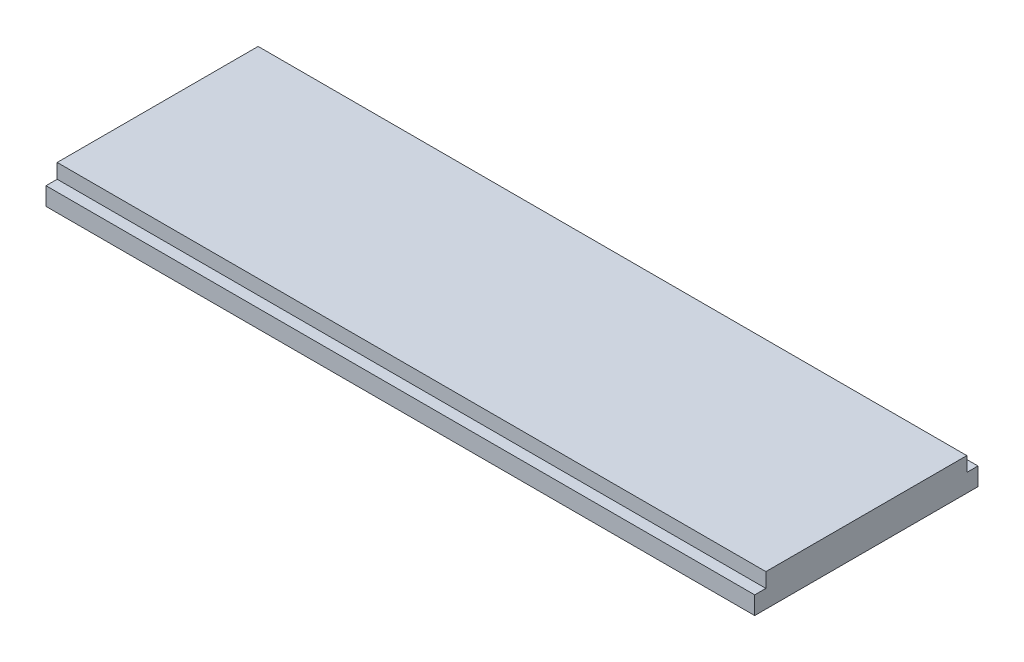
ISO-10303-21;
HEADER;
FILE_DESCRIPTION(('STEP AP214'),'2;1');
FILE_NAME('part.step','',(''),(''),'','','');
FILE_SCHEMA(('AUTOMOTIVE_DESIGN { 1 0 10303 214 1 1 1 1 }'));
ENDSEC;
DATA;
#1=APPLICATION_CONTEXT('core data for automotive mechanical design processes');
#2=APPLICATION_PROTOCOL_DEFINITION('international standard','automotive_design',2000,#1);
#3=PRODUCT_CONTEXT('',#1,'mechanical');
#4=PRODUCT('Part','Part','',(#3));
#5=PRODUCT_RELATED_PRODUCT_CATEGORY('part','',(#4));
#6=PRODUCT_DEFINITION_FORMATION('','',#4);
#7=PRODUCT_DEFINITION_CONTEXT('part definition',#1,'design');
#8=PRODUCT_DEFINITION('design','',#6,#7);
#9=PRODUCT_DEFINITION_SHAPE('','',#8);
#10=(LENGTH_UNIT() NAMED_UNIT(*) SI_UNIT(.MILLI.,.METRE.));
#11=(NAMED_UNIT(*) PLANE_ANGLE_UNIT() SI_UNIT($,.RADIAN.));
#12=(NAMED_UNIT(*) SI_UNIT($,.STERADIAN.) SOLID_ANGLE_UNIT());
#13=UNCERTAINTY_MEASURE_WITH_UNIT(LENGTH_MEASURE(1.E-05),#10,'distance_accuracy_value','');
#14=(GEOMETRIC_REPRESENTATION_CONTEXT(3) GLOBAL_UNCERTAINTY_ASSIGNED_CONTEXT((#13)) GLOBAL_UNIT_ASSIGNED_CONTEXT((#10,
#11,#12)) REPRESENTATION_CONTEXT('',''));
#15=CARTESIAN_POINT('',(0.,0.,0.));
#16=DIRECTION('',(0.,0.,1.));
#17=DIRECTION('',(1.,0.,0.));
#18=AXIS2_PLACEMENT_3D('',#15,#16,#17);
#19=CARTESIAN_POINT('',(0.,67.,-460.));
#20=DIRECTION('',(0.,0.,1.));
#21=DIRECTION('',(1.,0.,0.));
#22=AXIS2_PLACEMENT_3D('',#19,#20,#21);
#23=PLANE('',#22);
#24=DIRECTION('',(-1.,0.,0.));
#25=VECTOR('',#24,1.);
#26=CARTESIAN_POINT('',(0.,37.,-460.));
#27=LINE('',#26,#25);
#28=CARTESIAN_POINT('',(1460.,37.,-460.));
#29=VERTEX_POINT('',#28);
#30=CARTESIAN_POINT('',(0.,37.,-460.));
#31=VERTEX_POINT('',#30);
#32=EDGE_CURVE('E154',#29,#31,#27,.T.);
#33=ORIENTED_EDGE('',*,*,#32,.F.);
#34=DIRECTION('',(0.,-1.,0.));
#35=VECTOR('',#34,1.);
#36=CARTESIAN_POINT('',(1460.,67.,-460.));
#37=LINE('',#36,#35);
#38=CARTESIAN_POINT('',(1460.,0.,-460.));
#39=VERTEX_POINT('',#38);
#40=EDGE_CURVE('E145',#29,#39,#37,.T.);
#41=ORIENTED_EDGE('',*,*,#40,.T.);
#42=DIRECTION('',(-1.,0.,0.));
#43=VECTOR('',#42,1.);
#44=CARTESIAN_POINT('',(0.,0.,-460.));
#45=LINE('',#44,#43);
#46=CARTESIAN_POINT('',(0.,0.,-460.));
#47=VERTEX_POINT('',#46);
#48=EDGE_CURVE('E141',#39,#47,#45,.T.);
#49=ORIENTED_EDGE('',*,*,#48,.T.);
#50=DIRECTION('',(0.,-1.,0.));
#51=VECTOR('',#50,1.);
#52=CARTESIAN_POINT('',(0.,67.,-460.));
#53=LINE('',#52,#51);
#54=EDGE_CURVE('E125',#31,#47,#53,.T.);
#55=ORIENTED_EDGE('',*,*,#54,.F.);
#56=EDGE_LOOP('',(#33,#41,#49,#55));
#57=FACE_BOUND('',#56,.T.);
#58=ADVANCED_FACE('F37',(#57),#23,.F.);
#59=CARTESIAN_POINT('',(0.,67.,0.));
#60=DIRECTION('',(1.,0.,0.));
#61=DIRECTION('',(0.,0.,-1.));
#62=AXIS2_PLACEMENT_3D('',#59,#60,#61);
#63=PLANE('',#62);
#64=DIRECTION('',(0.,0.,1.));
#65=VECTOR('',#64,1.);
#66=CARTESIAN_POINT('',(0.,37.,0.));
#67=LINE('',#66,#65);
#68=CARTESIAN_POINT('',(0.,37.,-23.));
#69=VERTEX_POINT('',#68);
#70=CARTESIAN_POINT('',(0.,37.,0.));
#71=VERTEX_POINT('',#70);
#72=EDGE_CURVE('E102',#69,#71,#67,.T.);
#73=ORIENTED_EDGE('',*,*,#72,.F.);
#74=DIRECTION('',(0.,1.,0.));
#75=VECTOR('',#74,1.);
#76=CARTESIAN_POINT('',(0.,37.,-23.));
#77=LINE('',#76,#75);
#78=CARTESIAN_POINT('',(0.,67.,-23.));
#79=VERTEX_POINT('',#78);
#80=EDGE_CURVE('E130',#69,#79,#77,.T.);
#81=ORIENTED_EDGE('',*,*,#80,.T.);
#82=DIRECTION('',(0.,0.,1.));
#83=VECTOR('',#82,1.);
#84=CARTESIAN_POINT('',(0.,67.,0.));
#85=LINE('',#84,#83);
#86=CARTESIAN_POINT('',(0.,67.,-437.));
#87=VERTEX_POINT('',#86);
#88=EDGE_CURVE('E143',#87,#79,#85,.T.);
#89=ORIENTED_EDGE('',*,*,#88,.F.);
#90=DIRECTION('',(0.,1.,0.));
#91=VECTOR('',#90,1.);
#92=CARTESIAN_POINT('',(0.,37.,-437.));
#93=LINE('',#92,#91);
#94=CARTESIAN_POINT('',(0.,37.,-437.));
#95=VERTEX_POINT('',#94);
#96=EDGE_CURVE('E60',#95,#87,#93,.T.);
#97=ORIENTED_EDGE('',*,*,#96,.F.);
#98=DIRECTION('',(0.,0.,1.));
#99=VECTOR('',#98,1.);
#100=CARTESIAN_POINT('',(0.,37.,-460.));
#101=LINE('',#100,#99);
#102=EDGE_CURVE('E164',#31,#95,#101,.T.);
#103=ORIENTED_EDGE('',*,*,#102,.F.);
#104=ORIENTED_EDGE('',*,*,#54,.T.);
#105=DIRECTION('',(0.,0.,1.));
#106=VECTOR('',#105,1.);
#107=CARTESIAN_POINT('',(0.,0.,0.));
#108=LINE('',#107,#106);
#109=CARTESIAN_POINT('',(0.,0.,0.));
#110=VERTEX_POINT('',#109);
#111=EDGE_CURVE('E122',#47,#110,#108,.T.);
#112=ORIENTED_EDGE('',*,*,#111,.T.);
#113=DIRECTION('',(0.,-1.,0.));
#114=VECTOR('',#113,1.);
#115=CARTESIAN_POINT('',(0.,67.,0.));
#116=LINE('',#115,#114);
#117=EDGE_CURVE('E11',#71,#110,#116,.T.);
#118=ORIENTED_EDGE('',*,*,#117,.F.);
#119=EDGE_LOOP('',(#73,#81,#89,#97,#103,#104,#112,#118));
#120=FACE_BOUND('',#119,.T.);
#121=ADVANCED_FACE('F39',(#120),#63,.F.);
#122=CARTESIAN_POINT('',(0.,67.,0.));
#123=DIRECTION('',(0.,0.,-1.));
#124=DIRECTION('',(-1.,0.,0.));
#125=AXIS2_PLACEMENT_3D('',#122,#123,#124);
#126=PLANE('',#125);
#127=DIRECTION('',(0.,-1.,0.));
#128=VECTOR('',#127,1.);
#129=CARTESIAN_POINT('',(1460.,67.,0.));
#130=LINE('',#129,#128);
#131=CARTESIAN_POINT('',(1460.,37.,0.));
#132=VERTEX_POINT('',#131);
#133=CARTESIAN_POINT('',(1460.,0.,0.));
#134=VERTEX_POINT('',#133);
#135=EDGE_CURVE('E45',#132,#134,#130,.T.);
#136=ORIENTED_EDGE('',*,*,#135,.F.);
#137=DIRECTION('',(1.,0.,0.));
#138=VECTOR('',#137,1.);
#139=CARTESIAN_POINT('',(0.,37.,0.));
#140=LINE('',#139,#138);
#141=EDGE_CURVE('E105',#71,#132,#140,.T.);
#142=ORIENTED_EDGE('',*,*,#141,.F.);
#143=ORIENTED_EDGE('',*,*,#117,.T.);
#144=DIRECTION('',(1.,0.,0.));
#145=VECTOR('',#144,1.);
#146=CARTESIAN_POINT('',(0.,0.,0.));
#147=LINE('',#146,#145);
#148=EDGE_CURVE('E129',#110,#134,#147,.T.);
#149=ORIENTED_EDGE('',*,*,#148,.T.);
#150=EDGE_LOOP('',(#136,#142,#143,#149));
#151=FACE_BOUND('',#150,.T.);
#152=ADVANCED_FACE('F115',(#151),#126,.F.);
#153=CARTESIAN_POINT('',(1460.,67.,0.));
#154=DIRECTION('',(-1.,0.,0.));
#155=DIRECTION('',(0.,0.,1.));
#156=AXIS2_PLACEMENT_3D('',#153,#154,#155);
#157=PLANE('',#156);
#158=DIRECTION('',(0.,0.,-1.));
#159=VECTOR('',#158,1.);
#160=CARTESIAN_POINT('',(1460.,67.,0.));
#161=LINE('',#160,#159);
#162=CARTESIAN_POINT('',(1460.,67.,-23.));
#163=VERTEX_POINT('',#162);
#164=CARTESIAN_POINT('',(1460.,67.,-437.));
#165=VERTEX_POINT('',#164);
#166=EDGE_CURVE('E136',#163,#165,#161,.T.);
#167=ORIENTED_EDGE('',*,*,#166,.F.);
#168=DIRECTION('',(0.,1.,0.));
#169=VECTOR('',#168,1.);
#170=CARTESIAN_POINT('',(1460.,37.,-23.));
#171=LINE('',#170,#169);
#172=CARTESIAN_POINT('',(1460.,37.,-23.));
#173=VERTEX_POINT('',#172);
#174=EDGE_CURVE('E52',#173,#163,#171,.T.);
#175=ORIENTED_EDGE('',*,*,#174,.F.);
#176=DIRECTION('',(0.,0.,-1.));
#177=VECTOR('',#176,1.);
#178=CARTESIAN_POINT('',(1460.,37.,0.));
#179=LINE('',#178,#177);
#180=EDGE_CURVE('E118',#132,#173,#179,.T.);
#181=ORIENTED_EDGE('',*,*,#180,.F.);
#182=ORIENTED_EDGE('',*,*,#135,.T.);
#183=DIRECTION('',(0.,0.,-1.));
#184=VECTOR('',#183,1.);
#185=CARTESIAN_POINT('',(1460.,0.,0.));
#186=LINE('',#185,#184);
#187=EDGE_CURVE('E132',#134,#39,#186,.T.);
#188=ORIENTED_EDGE('',*,*,#187,.T.);
#189=ORIENTED_EDGE('',*,*,#40,.F.);
#190=DIRECTION('',(0.,0.,-1.));
#191=VECTOR('',#190,1.);
#192=CARTESIAN_POINT('',(1460.,37.,-460.));
#193=LINE('',#192,#191);
#194=CARTESIAN_POINT('',(1460.,37.,-437.));
#195=VERTEX_POINT('',#194);
#196=EDGE_CURVE('E157',#195,#29,#193,.T.);
#197=ORIENTED_EDGE('',*,*,#196,.F.);
#198=DIRECTION('',(0.,1.,0.));
#199=VECTOR('',#198,1.);
#200=CARTESIAN_POINT('',(1460.,37.,-437.));
#201=LINE('',#200,#199);
#202=EDGE_CURVE('E158',#195,#165,#201,.T.);
#203=ORIENTED_EDGE('',*,*,#202,.T.);
#204=EDGE_LOOP('',(#167,#175,#181,#182,#188,#189,#197,#203));
#205=FACE_BOUND('',#204,.T.);
#206=ADVANCED_FACE('F148',(#205),#157,.F.);
#207=CARTESIAN_POINT('',(0.,67.,0.));
#208=DIRECTION('',(0.,-1.,0.));
#209=DIRECTION('',(0.,0.,-1.));
#210=AXIS2_PLACEMENT_3D('',#207,#208,#209);
#211=PLANE('',#210);
#212=ORIENTED_EDGE('',*,*,#88,.T.);
#213=DIRECTION('',(-1.,0.,0.));
#214=VECTOR('',#213,1.);
#215=CARTESIAN_POINT('',(0.,67.,-23.));
#216=LINE('',#215,#214);
#217=EDGE_CURVE('E111',#163,#79,#216,.T.);
#218=ORIENTED_EDGE('',*,*,#217,.F.);
#219=ORIENTED_EDGE('',*,*,#166,.T.);
#220=DIRECTION('',(1.,0.,0.));
#221=VECTOR('',#220,1.);
#222=CARTESIAN_POINT('',(0.,67.,-437.));
#223=LINE('',#222,#221);
#224=EDGE_CURVE('E170',#87,#165,#223,.T.);
#225=ORIENTED_EDGE('',*,*,#224,.F.);
#226=EDGE_LOOP('',(#212,#218,#219,#225));
#227=FACE_BOUND('',#226,.T.);
#228=ADVANCED_FACE('F174',(#227),#211,.F.);
#229=CARTESIAN_POINT('',(0.,0.,0.));
#230=DIRECTION('',(0.,-1.,0.));
#231=DIRECTION('',(0.,0.,-1.));
#232=AXIS2_PLACEMENT_3D('',#229,#230,#231);
#233=PLANE('',#232);
#234=ORIENTED_EDGE('',*,*,#111,.F.);
#235=ORIENTED_EDGE('',*,*,#48,.F.);
#236=ORIENTED_EDGE('',*,*,#187,.F.);
#237=ORIENTED_EDGE('',*,*,#148,.F.);
#238=EDGE_LOOP('',(#234,#235,#236,#237));
#239=FACE_BOUND('',#238,.T.);
#240=ADVANCED_FACE('F151',(#239),#233,.T.);
#241=CARTESIAN_POINT('',(0.,37.,-437.));
#242=DIRECTION('',(0.,0.,1.));
#243=DIRECTION('',(1.,0.,0.));
#244=AXIS2_PLACEMENT_3D('',#241,#242,#243);
#245=PLANE('',#244);
#246=ORIENTED_EDGE('',*,*,#224,.T.);
#247=ORIENTED_EDGE('',*,*,#202,.F.);
#248=DIRECTION('',(1.,0.,0.));
#249=VECTOR('',#248,1.);
#250=CARTESIAN_POINT('',(0.,37.,-437.));
#251=LINE('',#250,#249);
#252=EDGE_CURVE('E162',#95,#195,#251,.T.);
#253=ORIENTED_EDGE('',*,*,#252,.F.);
#254=ORIENTED_EDGE('',*,*,#96,.T.);
#255=EDGE_LOOP('',(#246,#247,#253,#254));
#256=FACE_BOUND('',#255,.T.);
#257=ADVANCED_FACE('F183',(#256),#245,.F.);
#258=CARTESIAN_POINT('',(0.,37.,0.));
#259=DIRECTION('',(0.,1.,0.));
#260=DIRECTION('',(0.,0.,1.));
#261=AXIS2_PLACEMENT_3D('',#258,#259,#260);
#262=PLANE('',#261);
#263=ORIENTED_EDGE('',*,*,#102,.T.);
#264=ORIENTED_EDGE('',*,*,#252,.T.);
#265=ORIENTED_EDGE('',*,*,#196,.T.);
#266=ORIENTED_EDGE('',*,*,#32,.T.);
#267=EDGE_LOOP('',(#263,#264,#265,#266));
#268=FACE_BOUND('',#267,.T.);
#269=ADVANCED_FACE('F182',(#268),#262,.T.);
#270=CARTESIAN_POINT('',(0.,37.,-23.));
#271=DIRECTION('',(0.,0.,-1.));
#272=DIRECTION('',(-1.,0.,0.));
#273=AXIS2_PLACEMENT_3D('',#270,#271,#272);
#274=PLANE('',#273);
#275=ORIENTED_EDGE('',*,*,#217,.T.);
#276=ORIENTED_EDGE('',*,*,#80,.F.);
#277=DIRECTION('',(-1.,0.,0.));
#278=VECTOR('',#277,1.);
#279=CARTESIAN_POINT('',(0.,37.,-23.));
#280=LINE('',#279,#278);
#281=EDGE_CURVE('E107',#173,#69,#280,.T.);
#282=ORIENTED_EDGE('',*,*,#281,.F.);
#283=ORIENTED_EDGE('',*,*,#174,.T.);
#284=EDGE_LOOP('',(#275,#276,#282,#283));
#285=FACE_BOUND('',#284,.T.);
#286=ADVANCED_FACE('F181',(#285),#274,.F.);
#287=CARTESIAN_POINT('',(0.,37.,0.));
#288=DIRECTION('',(0.,-1.,0.));
#289=DIRECTION('',(0.,0.,-1.));
#290=AXIS2_PLACEMENT_3D('',#287,#288,#289);
#291=PLANE('',#290);
#292=ORIENTED_EDGE('',*,*,#72,.T.);
#293=ORIENTED_EDGE('',*,*,#141,.T.);
#294=ORIENTED_EDGE('',*,*,#180,.T.);
#295=ORIENTED_EDGE('',*,*,#281,.T.);
#296=EDGE_LOOP('',(#292,#293,#294,#295));
#297=FACE_BOUND('',#296,.T.);
#298=ADVANCED_FACE('F104',(#297),#291,.F.);
#299=CLOSED_SHELL('',(#58,#121,#152,#206,#228,#240,#257,#269,#286,#298));
#300=MANIFOLD_SOLID_BREP('B2',#299);
#301=ADVANCED_BREP_SHAPE_REPRESENTATION('',(#18,#300),#14);
#302=SHAPE_DEFINITION_REPRESENTATION(#9,#301);
ENDSEC;
END-ISO-10303-21;
